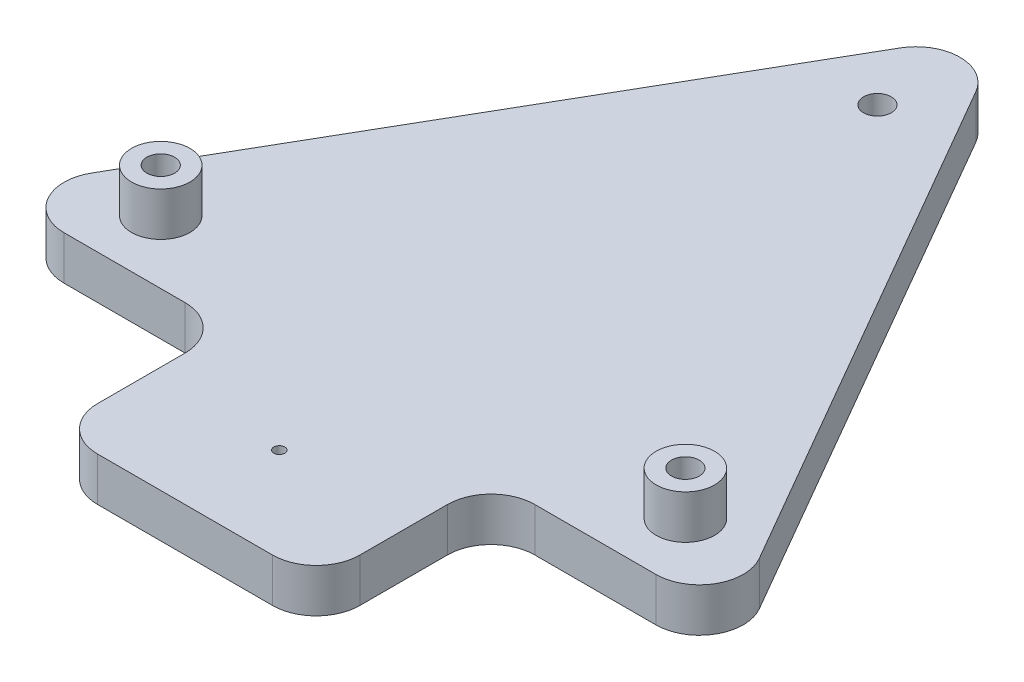
ISO-10303-21;
HEADER;
FILE_DESCRIPTION(('STEP AP214'),'2;1');
FILE_NAME('part.step','',(''),(''),'','','');
FILE_SCHEMA(('AUTOMOTIVE_DESIGN { 1 0 10303 214 1 1 1 1 }'));
ENDSEC;
DATA;
#1=APPLICATION_CONTEXT('core data for automotive mechanical design processes');
#2=APPLICATION_PROTOCOL_DEFINITION('international standard','automotive_design',2000,#1);
#3=PRODUCT_CONTEXT('',#1,'mechanical');
#4=PRODUCT('Part','Part','',(#3));
#5=PRODUCT_RELATED_PRODUCT_CATEGORY('part','',(#4));
#6=PRODUCT_DEFINITION_FORMATION('','',#4);
#7=PRODUCT_DEFINITION_CONTEXT('part definition',#1,'design');
#8=PRODUCT_DEFINITION('design','',#6,#7);
#9=PRODUCT_DEFINITION_SHAPE('','',#8);
#10=(LENGTH_UNIT() NAMED_UNIT(*) SI_UNIT(.MILLI.,.METRE.));
#11=(NAMED_UNIT(*) PLANE_ANGLE_UNIT() SI_UNIT($,.RADIAN.));
#12=(NAMED_UNIT(*) SI_UNIT($,.STERADIAN.) SOLID_ANGLE_UNIT());
#13=UNCERTAINTY_MEASURE_WITH_UNIT(LENGTH_MEASURE(1.E-05),#10,'distance_accuracy_value','');
#14=(GEOMETRIC_REPRESENTATION_CONTEXT(3) GLOBAL_UNCERTAINTY_ASSIGNED_CONTEXT((#13)) GLOBAL_UNIT_ASSIGNED_CONTEXT((#10,
#11,#12)) REPRESENTATION_CONTEXT('',''));
#15=CARTESIAN_POINT('',(0.,0.,0.));
#16=DIRECTION('',(0.,0.,1.));
#17=DIRECTION('',(1.,0.,0.));
#18=AXIS2_PLACEMENT_3D('',#15,#16,#17);
#19=CARTESIAN_POINT('',(-40.,10.,10.));
#20=DIRECTION('',(0.,1.,0.));
#21=DIRECTION('',(0.,0.,1.));
#22=AXIS2_PLACEMENT_3D('',#19,#20,#21);
#23=PLANE('',#22);
#24=CARTESIAN_POINT('',(-60.,10.,-14.4337567297406));
#25=DIRECTION('',(0.,1.,0.));
#26=DIRECTION('',(0.,0.,1.));
#27=AXIS2_PLACEMENT_3D('',#24,#25,#26);
#28=CIRCLE('',#27,6.675);
#29=CARTESIAN_POINT('',(-60.,10.,-7.75875672974062));
#30=VERTEX_POINT('',#29);
#31=EDGE_CURVE('E386',#30,#30,#28,.T.);
#32=ORIENTED_EDGE('',*,*,#31,.F.);
#33=EDGE_LOOP('',(#32));
#34=FACE_BOUND('',#33,.T.);
#35=CARTESIAN_POINT('',(-40.,10.,10.));
#36=DIRECTION('',(0.,-1.,0.));
#37=DIRECTION('',(0.,0.,1.));
#38=AXIS2_PLACEMENT_3D('',#35,#36,#37);
#39=CIRCLE('',#38,10.);
#40=CARTESIAN_POINT('',(-40.0000000000001,10.,0.));
#41=VERTEX_POINT('',#40);
#42=CARTESIAN_POINT('',(-30.,10.,10.0000000000001));
#43=VERTEX_POINT('',#42);
#44=EDGE_CURVE('E218',#41,#43,#39,.T.);
#45=ORIENTED_EDGE('',*,*,#44,.T.);
#46=DIRECTION('',(0.,0.,1.));
#47=VECTOR('',#46,1.);
#48=CARTESIAN_POINT('',(-30.,10.,10.0000000000001));
#49=LINE('',#48,#47);
#50=CARTESIAN_POINT('',(-30.,10.,29.9999999999999));
#51=VERTEX_POINT('',#50);
#52=EDGE_CURVE('E118',#43,#51,#49,.T.);
#53=ORIENTED_EDGE('',*,*,#52,.T.);
#54=CARTESIAN_POINT('',(-20.,10.,30.));
#55=DIRECTION('',(0.,1.,0.));
#56=DIRECTION('',(0.,0.,1.));
#57=AXIS2_PLACEMENT_3D('',#54,#55,#56);
#58=CIRCLE('',#57,10.);
#59=CARTESIAN_POINT('',(-20.,10.,40.));
#60=VERTEX_POINT('',#59);
#61=EDGE_CURVE('E263',#51,#60,#58,.T.);
#62=ORIENTED_EDGE('',*,*,#61,.T.);
#63=DIRECTION('',(1.,0.,0.));
#64=VECTOR('',#63,1.);
#65=CARTESIAN_POINT('',(-19.9999999999999,10.,40.));
#66=LINE('',#65,#64);
#67=CARTESIAN_POINT('',(19.9999999999999,10.,40.));
#68=VERTEX_POINT('',#67);
#69=EDGE_CURVE('E283',#60,#68,#66,.T.);
#70=ORIENTED_EDGE('',*,*,#69,.T.);
#71=CARTESIAN_POINT('',(20.,10.,30.));
#72=DIRECTION('',(0.,1.,0.));
#73=DIRECTION('',(0.,0.,1.));
#74=AXIS2_PLACEMENT_3D('',#71,#72,#73);
#75=CIRCLE('',#74,10.);
#76=CARTESIAN_POINT('',(30.,10.,29.9999999999999));
#77=VERTEX_POINT('',#76);
#78=EDGE_CURVE('E279',#68,#77,#75,.T.);
#79=ORIENTED_EDGE('',*,*,#78,.T.);
#80=DIRECTION('',(0.,0.,-1.));
#81=VECTOR('',#80,1.);
#82=CARTESIAN_POINT('',(30.,10.,29.9999999999999));
#83=LINE('',#82,#81);
#84=CARTESIAN_POINT('',(30.,10.,10.0000000000001));
#85=VERTEX_POINT('',#84);
#86=EDGE_CURVE('E282',#77,#85,#83,.T.);
#87=ORIENTED_EDGE('',*,*,#86,.T.);
#88=CARTESIAN_POINT('',(40.,10.,9.99999999999999));
#89=DIRECTION('',(0.,-1.,0.));
#90=DIRECTION('',(0.,0.,-1.));
#91=AXIS2_PLACEMENT_3D('',#88,#89,#90);
#92=CIRCLE('',#91,10.);
#93=CARTESIAN_POINT('',(40.,10.,0.));
#94=VERTEX_POINT('',#93);
#95=EDGE_CURVE('E287',#85,#94,#92,.T.);
#96=ORIENTED_EDGE('',*,*,#95,.T.);
#97=DIRECTION('',(1.,0.,0.));
#98=VECTOR('',#97,1.);
#99=CARTESIAN_POINT('',(40.0000000000001,10.,0.));
#100=LINE('',#99,#98);
#101=CARTESIAN_POINT('',(67.6794919243111,10.,0.));
#102=VERTEX_POINT('',#101);
#103=EDGE_CURVE('E294',#94,#102,#100,.T.);
#104=ORIENTED_EDGE('',*,*,#103,.T.);
#105=CARTESIAN_POINT('',(67.6794919243113,10.,-10.));
#106=DIRECTION('',(0.,1.,0.));
#107=DIRECTION('',(0.,0.,1.));
#108=AXIS2_PLACEMENT_3D('',#105,#106,#107);
#109=CIRCLE('',#108,9.99999999999999);
#110=CARTESIAN_POINT('',(76.3397459621555,10.,-15.0000000000001));
#111=VERTEX_POINT('',#110);
#112=EDGE_CURVE('E297',#102,#111,#109,.T.);
#113=ORIENTED_EDGE('',*,*,#112,.T.);
#114=DIRECTION('',(-0.5,0.,-0.866025403784439));
#115=VECTOR('',#114,1.);
#116=CARTESIAN_POINT('',(8.66025403784444,10.,-132.224318643354));
#117=LINE('',#116,#115);
#118=CARTESIAN_POINT('',(8.66025403784444,10.,-132.224318643354));
#119=VERTEX_POINT('',#118);
#120=EDGE_CURVE('E300',#111,#119,#117,.T.);
#121=ORIENTED_EDGE('',*,*,#120,.T.);
#122=CARTESIAN_POINT('',(0.,10.,-127.224318643355));
#123=DIRECTION('',(0.,1.,0.));
#124=DIRECTION('',(0.,0.,-1.));
#125=AXIS2_PLACEMENT_3D('',#122,#123,#124);
#126=CIRCLE('',#125,10.);
#127=CARTESIAN_POINT('',(-8.66025403784448,10.,-132.224318643354));
#128=VERTEX_POINT('',#127);
#129=EDGE_CURVE('E155',#119,#128,#126,.T.);
#130=ORIENTED_EDGE('',*,*,#129,.T.);
#131=DIRECTION('',(-0.5,0.,0.866025403784439));
#132=VECTOR('',#131,1.);
#133=CARTESIAN_POINT('',(-76.3397459621555,10.,-15.0000000000001));
#134=LINE('',#133,#132);
#135=CARTESIAN_POINT('',(-76.3397459621555,10.,-15.0000000000001));
#136=VERTEX_POINT('',#135);
#137=EDGE_CURVE('E149',#128,#136,#134,.T.);
#138=ORIENTED_EDGE('',*,*,#137,.T.);
#139=CARTESIAN_POINT('',(-67.6794919243112,10.,-10.));
#140=DIRECTION('',(0.,1.,0.));
#141=DIRECTION('',(0.,0.,-1.));
#142=AXIS2_PLACEMENT_3D('',#139,#140,#141);
#143=CIRCLE('',#142,10.);
#144=CARTESIAN_POINT('',(-67.6794919243111,10.,0.));
#145=VERTEX_POINT('',#144);
#146=EDGE_CURVE('E153',#136,#145,#143,.T.);
#147=ORIENTED_EDGE('',*,*,#146,.T.);
#148=DIRECTION('',(1.,0.,0.));
#149=VECTOR('',#148,1.);
#150=CARTESIAN_POINT('',(-67.6794919243111,10.,0.));
#151=LINE('',#150,#149);
#152=EDGE_CURVE('E57',#145,#41,#151,.T.);
#153=ORIENTED_EDGE('',*,*,#152,.T.);
#154=EDGE_LOOP('',(#45,#53,#62,#70,#79,#87,#96,#104,#113,#121,#130,#138,#147,#153));
#155=FACE_BOUND('',#154,.T.);
#156=CARTESIAN_POINT('',(0.,10.,-118.356805183873));
#157=DIRECTION('',(0.,1.,0.));
#158=DIRECTION('',(0.,0.,1.));
#159=AXIS2_PLACEMENT_3D('',#156,#157,#158);
#160=CIRCLE('',#159,3.175);
#161=CARTESIAN_POINT('',(0.,10.,-115.181805183873));
#162=VERTEX_POINT('',#161);
#163=EDGE_CURVE('E407',#162,#162,#160,.T.);
#164=ORIENTED_EDGE('',*,*,#163,.F.);
#165=EDGE_LOOP('',(#164));
#166=FACE_BOUND('',#165,.T.);
#167=CARTESIAN_POINT('',(0.,10.,18.4501948161268));
#168=DIRECTION('',(0.,1.,0.));
#169=DIRECTION('',(0.,0.,1.));
#170=AXIS2_PLACEMENT_3D('',#167,#168,#169);
#171=CIRCLE('',#170,1.25);
#172=CARTESIAN_POINT('',(0.,10.,19.7001948161268));
#173=VERTEX_POINT('',#172);
#174=EDGE_CURVE('E395',#173,#173,#171,.T.);
#175=ORIENTED_EDGE('',*,*,#174,.F.);
#176=EDGE_LOOP('',(#175));
#177=FACE_BOUND('',#176,.T.);
#178=CARTESIAN_POINT('',(60.,10.,-14.4337567297406));
#179=DIRECTION('',(0.,1.,0.));
#180=DIRECTION('',(0.,0.,1.));
#181=AXIS2_PLACEMENT_3D('',#178,#179,#180);
#182=CIRCLE('',#181,6.675);
#183=CARTESIAN_POINT('',(60.,10.,-7.75875672974062));
#184=VERTEX_POINT('',#183);
#185=EDGE_CURVE('E374',#184,#184,#182,.T.);
#186=ORIENTED_EDGE('',*,*,#185,.F.);
#187=EDGE_LOOP('',(#186));
#188=FACE_BOUND('',#187,.T.);
#189=ADVANCED_FACE('F39',(#34,#155,#166,#177,#188),#23,.T.);
#190=CARTESIAN_POINT('',(-40.,0.,10.));
#191=DIRECTION('',(0.,1.,0.));
#192=DIRECTION('',(0.,0.,1.));
#193=AXIS2_PLACEMENT_3D('',#190,#191,#192);
#194=PLANE('',#193);
#195=CARTESIAN_POINT('',(-40.,0.,10.));
#196=DIRECTION('',(0.,-1.,0.));
#197=DIRECTION('',(0.,0.,1.));
#198=AXIS2_PLACEMENT_3D('',#195,#196,#197);
#199=CIRCLE('',#198,10.);
#200=CARTESIAN_POINT('',(-40.0000000000001,0.,0.));
#201=VERTEX_POINT('',#200);
#202=CARTESIAN_POINT('',(-30.,0.,10.0000000000001));
#203=VERTEX_POINT('',#202);
#204=EDGE_CURVE('E177',#201,#203,#199,.T.);
#205=ORIENTED_EDGE('',*,*,#204,.F.);
#206=DIRECTION('',(1.,0.,0.));
#207=VECTOR('',#206,1.);
#208=CARTESIAN_POINT('',(-67.6794919243111,0.,0.));
#209=LINE('',#208,#207);
#210=CARTESIAN_POINT('',(-67.6794919243111,0.,0.));
#211=VERTEX_POINT('',#210);
#212=EDGE_CURVE('E110',#211,#201,#209,.T.);
#213=ORIENTED_EDGE('',*,*,#212,.F.);
#214=CARTESIAN_POINT('',(-67.6794919243112,0.,-10.));
#215=DIRECTION('',(0.,1.,0.));
#216=DIRECTION('',(0.,0.,-1.));
#217=AXIS2_PLACEMENT_3D('',#214,#215,#216);
#218=CIRCLE('',#217,10.);
#219=CARTESIAN_POINT('',(-76.3397459621555,0.,-15.0000000000001));
#220=VERTEX_POINT('',#219);
#221=EDGE_CURVE('E104',#220,#211,#218,.T.);
#222=ORIENTED_EDGE('',*,*,#221,.F.);
#223=DIRECTION('',(-0.5,0.,0.866025403784439));
#224=VECTOR('',#223,1.);
#225=CARTESIAN_POINT('',(-76.3397459621555,0.,-15.0000000000001));
#226=LINE('',#225,#224);
#227=CARTESIAN_POINT('',(-8.66025403784448,0.,-132.224318643354));
#228=VERTEX_POINT('',#227);
#229=EDGE_CURVE('E164',#228,#220,#226,.T.);
#230=ORIENTED_EDGE('',*,*,#229,.F.);
#231=CARTESIAN_POINT('',(0.,0.,-127.224318643355));
#232=DIRECTION('',(0.,1.,0.));
#233=DIRECTION('',(0.,0.,-1.));
#234=AXIS2_PLACEMENT_3D('',#231,#232,#233);
#235=CIRCLE('',#234,10.);
#236=CARTESIAN_POINT('',(8.66025403784444,0.,-132.224318643354));
#237=VERTEX_POINT('',#236);
#238=EDGE_CURVE('E209',#237,#228,#235,.T.);
#239=ORIENTED_EDGE('',*,*,#238,.F.);
#240=DIRECTION('',(-0.5,0.,-0.866025403784439));
#241=VECTOR('',#240,1.);
#242=CARTESIAN_POINT('',(8.66025403784444,0.,-132.224318643354));
#243=LINE('',#242,#241);
#244=CARTESIAN_POINT('',(76.3397459621555,0.,-15.0000000000001));
#245=VERTEX_POINT('',#244);
#246=EDGE_CURVE('E206',#245,#237,#243,.T.);
#247=ORIENTED_EDGE('',*,*,#246,.F.);
#248=CARTESIAN_POINT('',(67.6794919243113,0.,-10.));
#249=DIRECTION('',(0.,1.,0.));
#250=DIRECTION('',(0.,0.,1.));
#251=AXIS2_PLACEMENT_3D('',#248,#249,#250);
#252=CIRCLE('',#251,9.99999999999999);
#253=CARTESIAN_POINT('',(67.6794919243111,0.,0.));
#254=VERTEX_POINT('',#253);
#255=EDGE_CURVE('E203',#254,#245,#252,.T.);
#256=ORIENTED_EDGE('',*,*,#255,.F.);
#257=DIRECTION('',(1.,0.,0.));
#258=VECTOR('',#257,1.);
#259=CARTESIAN_POINT('',(40.0000000000001,0.,0.));
#260=LINE('',#259,#258);
#261=CARTESIAN_POINT('',(40.,0.,0.));
#262=VERTEX_POINT('',#261);
#263=EDGE_CURVE('E200',#262,#254,#260,.T.);
#264=ORIENTED_EDGE('',*,*,#263,.F.);
#265=CARTESIAN_POINT('',(40.,0.,9.99999999999999));
#266=DIRECTION('',(0.,-1.,0.));
#267=DIRECTION('',(0.,0.,-1.));
#268=AXIS2_PLACEMENT_3D('',#265,#266,#267);
#269=CIRCLE('',#268,10.);
#270=CARTESIAN_POINT('',(30.,0.,10.0000000000001));
#271=VERTEX_POINT('',#270);
#272=EDGE_CURVE('E197',#271,#262,#269,.T.);
#273=ORIENTED_EDGE('',*,*,#272,.F.);
#274=DIRECTION('',(0.,0.,-1.));
#275=VECTOR('',#274,1.);
#276=CARTESIAN_POINT('',(30.,0.,29.9999999999999));
#277=LINE('',#276,#275);
#278=CARTESIAN_POINT('',(30.,0.,29.9999999999999));
#279=VERTEX_POINT('',#278);
#280=EDGE_CURVE('E194',#279,#271,#277,.T.);
#281=ORIENTED_EDGE('',*,*,#280,.F.);
#282=CARTESIAN_POINT('',(20.,0.,30.));
#283=DIRECTION('',(0.,1.,0.));
#284=DIRECTION('',(0.,0.,1.));
#285=AXIS2_PLACEMENT_3D('',#282,#283,#284);
#286=CIRCLE('',#285,10.);
#287=CARTESIAN_POINT('',(19.9999999999999,0.,40.));
#288=VERTEX_POINT('',#287);
#289=EDGE_CURVE('E191',#288,#279,#286,.T.);
#290=ORIENTED_EDGE('',*,*,#289,.F.);
#291=DIRECTION('',(1.,0.,0.));
#292=VECTOR('',#291,1.);
#293=CARTESIAN_POINT('',(-19.9999999999999,0.,40.));
#294=LINE('',#293,#292);
#295=CARTESIAN_POINT('',(-20.,0.,40.));
#296=VERTEX_POINT('',#295);
#297=EDGE_CURVE('E188',#296,#288,#294,.T.);
#298=ORIENTED_EDGE('',*,*,#297,.F.);
#299=CARTESIAN_POINT('',(-20.,0.,30.));
#300=DIRECTION('',(0.,1.,0.));
#301=DIRECTION('',(0.,0.,1.));
#302=AXIS2_PLACEMENT_3D('',#299,#300,#301);
#303=CIRCLE('',#302,10.);
#304=CARTESIAN_POINT('',(-30.,0.,29.9999999999999));
#305=VERTEX_POINT('',#304);
#306=EDGE_CURVE('E185',#305,#296,#303,.T.);
#307=ORIENTED_EDGE('',*,*,#306,.F.);
#308=DIRECTION('',(0.,0.,1.));
#309=VECTOR('',#308,1.);
#310=CARTESIAN_POINT('',(-30.,0.,10.0000000000001));
#311=LINE('',#310,#309);
#312=EDGE_CURVE('E181',#203,#305,#311,.T.);
#313=ORIENTED_EDGE('',*,*,#312,.F.);
#314=EDGE_LOOP('',(#205,#213,#222,#230,#239,#247,#256,#264,#273,#281,#290,#298,#307,#313));
#315=FACE_BOUND('',#314,.T.);
#316=CARTESIAN_POINT('',(-60.,0.,-14.4337567297406));
#317=DIRECTION('',(0.,1.,0.));
#318=DIRECTION('',(0.,0.,1.));
#319=AXIS2_PLACEMENT_3D('',#316,#317,#318);
#320=CIRCLE('',#319,3.175);
#321=CARTESIAN_POINT('',(-60.,0.,-11.2587567297406));
#322=VERTEX_POINT('',#321);
#323=EDGE_CURVE('E182',#322,#322,#320,.T.);
#324=ORIENTED_EDGE('',*,*,#323,.T.);
#325=EDGE_LOOP('',(#324));
#326=FACE_BOUND('',#325,.T.);
#327=CARTESIAN_POINT('',(0.,0.,-118.356805183873));
#328=DIRECTION('',(0.,1.,0.));
#329=DIRECTION('',(0.,0.,1.));
#330=AXIS2_PLACEMENT_3D('',#327,#328,#329);
#331=CIRCLE('',#330,3.175);
#332=CARTESIAN_POINT('',(0.,0.,-115.181805183873));
#333=VERTEX_POINT('',#332);
#334=EDGE_CURVE('E406',#333,#333,#331,.T.);
#335=ORIENTED_EDGE('',*,*,#334,.T.);
#336=EDGE_LOOP('',(#335));
#337=FACE_BOUND('',#336,.T.);
#338=CARTESIAN_POINT('',(60.,0.,-14.4337567297406));
#339=DIRECTION('',(0.,1.,0.));
#340=DIRECTION('',(0.,0.,1.));
#341=AXIS2_PLACEMENT_3D('',#338,#339,#340);
#342=CIRCLE('',#341,3.175);
#343=CARTESIAN_POINT('',(60.,0.,-11.2587567297406));
#344=VERTEX_POINT('',#343);
#345=EDGE_CURVE('E399',#344,#344,#342,.T.);
#346=ORIENTED_EDGE('',*,*,#345,.T.);
#347=EDGE_LOOP('',(#346));
#348=FACE_BOUND('',#347,.T.);
#349=CARTESIAN_POINT('',(0.,0.,18.4501948161268));
#350=DIRECTION('',(0.,1.,0.));
#351=DIRECTION('',(0.,0.,1.));
#352=AXIS2_PLACEMENT_3D('',#349,#350,#351);
#353=CIRCLE('',#352,1.25);
#354=CARTESIAN_POINT('',(0.,0.,19.7001948161268));
#355=VERTEX_POINT('',#354);
#356=EDGE_CURVE('E391',#355,#355,#353,.T.);
#357=ORIENTED_EDGE('',*,*,#356,.T.);
#358=EDGE_LOOP('',(#357));
#359=FACE_BOUND('',#358,.T.);
#360=ADVANCED_FACE('F267',(#315,#326,#337,#348,#359),#194,.F.);
#361=CARTESIAN_POINT('',(-40.,10.,10.));
#362=DIRECTION('',(0.,-1.,0.));
#363=DIRECTION('',(0.,0.,-1.));
#364=AXIS2_PLACEMENT_3D('',#361,#362,#363);
#365=CYLINDRICAL_SURFACE('',#364,10.);
#366=ORIENTED_EDGE('',*,*,#204,.T.);
#367=DIRECTION('',(0.,-1.,0.));
#368=VECTOR('',#367,1.);
#369=CARTESIAN_POINT('',(-30.,10.,10.0000000000001));
#370=LINE('',#369,#368);
#371=EDGE_CURVE('E11',#43,#203,#370,.T.);
#372=ORIENTED_EDGE('',*,*,#371,.F.);
#373=ORIENTED_EDGE('',*,*,#44,.F.);
#374=DIRECTION('',(0.,-1.,0.));
#375=VECTOR('',#374,1.);
#376=CARTESIAN_POINT('',(-40.0000000000001,10.,0.));
#377=LINE('',#376,#375);
#378=EDGE_CURVE('E173',#41,#201,#377,.T.);
#379=ORIENTED_EDGE('',*,*,#378,.T.);
#380=EDGE_LOOP('',(#366,#372,#373,#379));
#381=FACE_BOUND('',#380,.T.);
#382=ADVANCED_FACE('F41',(#381),#365,.F.);
#383=CARTESIAN_POINT('',(-30.,10.,10.0000000000001));
#384=DIRECTION('',(1.,0.,0.));
#385=DIRECTION('',(0.,0.,-1.));
#386=AXIS2_PLACEMENT_3D('',#383,#384,#385);
#387=PLANE('',#386);
#388=ORIENTED_EDGE('',*,*,#312,.T.);
#389=DIRECTION('',(0.,-1.,0.));
#390=VECTOR('',#389,1.);
#391=CARTESIAN_POINT('',(-30.,10.,29.9999999999999));
#392=LINE('',#391,#390);
#393=EDGE_CURVE('E49',#51,#305,#392,.T.);
#394=ORIENTED_EDGE('',*,*,#393,.F.);
#395=ORIENTED_EDGE('',*,*,#52,.F.);
#396=ORIENTED_EDGE('',*,*,#371,.T.);
#397=EDGE_LOOP('',(#388,#394,#395,#396));
#398=FACE_BOUND('',#397,.T.);
#399=ADVANCED_FACE('F589',(#398),#387,.F.);
#400=CARTESIAN_POINT('',(-20.,10.,30.));
#401=DIRECTION('',(0.,-1.,0.));
#402=DIRECTION('',(0.,0.,-1.));
#403=AXIS2_PLACEMENT_3D('',#400,#401,#402);
#404=CYLINDRICAL_SURFACE('',#403,10.);
#405=ORIENTED_EDGE('',*,*,#306,.T.);
#406=DIRECTION('',(0.,-1.,0.));
#407=VECTOR('',#406,1.);
#408=CARTESIAN_POINT('',(-20.,10.,40.));
#409=LINE('',#408,#407);
#410=EDGE_CURVE('E253',#60,#296,#409,.T.);
#411=ORIENTED_EDGE('',*,*,#410,.F.);
#412=ORIENTED_EDGE('',*,*,#61,.F.);
#413=ORIENTED_EDGE('',*,*,#393,.T.);
#414=EDGE_LOOP('',(#405,#411,#412,#413));
#415=FACE_BOUND('',#414,.T.);
#416=ADVANCED_FACE('F261',(#415),#404,.T.);
#417=CARTESIAN_POINT('',(-19.9999999999999,10.,40.));
#418=DIRECTION('',(0.,0.,-1.));
#419=DIRECTION('',(-1.,0.,0.));
#420=AXIS2_PLACEMENT_3D('',#417,#418,#419);
#421=PLANE('',#420);
#422=ORIENTED_EDGE('',*,*,#297,.T.);
#423=DIRECTION('',(0.,-1.,0.));
#424=VECTOR('',#423,1.);
#425=CARTESIAN_POINT('',(19.9999999999999,10.,40.));
#426=LINE('',#425,#424);
#427=EDGE_CURVE('E249',#68,#288,#426,.T.);
#428=ORIENTED_EDGE('',*,*,#427,.F.);
#429=ORIENTED_EDGE('',*,*,#69,.F.);
#430=ORIENTED_EDGE('',*,*,#410,.T.);
#431=EDGE_LOOP('',(#422,#428,#429,#430));
#432=FACE_BOUND('',#431,.T.);
#433=ADVANCED_FACE('F273',(#432),#421,.F.);
#434=CARTESIAN_POINT('',(20.,10.,30.));
#435=DIRECTION('',(0.,-1.,0.));
#436=DIRECTION('',(0.,0.,-1.));
#437=AXIS2_PLACEMENT_3D('',#434,#435,#436);
#438=CYLINDRICAL_SURFACE('',#437,10.);
#439=ORIENTED_EDGE('',*,*,#289,.T.);
#440=DIRECTION('',(0.,-1.,0.));
#441=VECTOR('',#440,1.);
#442=CARTESIAN_POINT('',(30.,10.,29.9999999999999));
#443=LINE('',#442,#441);
#444=EDGE_CURVE('E245',#77,#279,#443,.T.);
#445=ORIENTED_EDGE('',*,*,#444,.F.);
#446=ORIENTED_EDGE('',*,*,#78,.F.);
#447=ORIENTED_EDGE('',*,*,#427,.T.);
#448=EDGE_LOOP('',(#439,#445,#446,#447));
#449=FACE_BOUND('',#448,.T.);
#450=ADVANCED_FACE('F277',(#449),#438,.T.);
#451=CARTESIAN_POINT('',(30.,10.,29.9999999999999));
#452=DIRECTION('',(-1.,0.,0.));
#453=DIRECTION('',(0.,0.,1.));
#454=AXIS2_PLACEMENT_3D('',#451,#452,#453);
#455=PLANE('',#454);
#456=ORIENTED_EDGE('',*,*,#280,.T.);
#457=DIRECTION('',(0.,-1.,0.));
#458=VECTOR('',#457,1.);
#459=CARTESIAN_POINT('',(30.,10.,10.0000000000001));
#460=LINE('',#459,#458);
#461=EDGE_CURVE('E241',#85,#271,#460,.T.);
#462=ORIENTED_EDGE('',*,*,#461,.F.);
#463=ORIENTED_EDGE('',*,*,#86,.F.);
#464=ORIENTED_EDGE('',*,*,#444,.T.);
#465=EDGE_LOOP('',(#456,#462,#463,#464));
#466=FACE_BOUND('',#465,.T.);
#467=ADVANCED_FACE('F554',(#466),#455,.F.);
#468=CARTESIAN_POINT('',(40.,10.,9.99999999999999));
#469=DIRECTION('',(0.,-1.,0.));
#470=DIRECTION('',(0.,0.,-1.));
#471=AXIS2_PLACEMENT_3D('',#468,#469,#470);
#472=CYLINDRICAL_SURFACE('',#471,10.);
#473=ORIENTED_EDGE('',*,*,#272,.T.);
#474=DIRECTION('',(0.,-1.,0.));
#475=VECTOR('',#474,1.);
#476=CARTESIAN_POINT('',(40.,10.,0.));
#477=LINE('',#476,#475);
#478=EDGE_CURVE('E237',#94,#262,#477,.T.);
#479=ORIENTED_EDGE('',*,*,#478,.F.);
#480=ORIENTED_EDGE('',*,*,#95,.F.);
#481=ORIENTED_EDGE('',*,*,#461,.T.);
#482=EDGE_LOOP('',(#473,#479,#480,#481));
#483=FACE_BOUND('',#482,.T.);
#484=ADVANCED_FACE('F544',(#483),#472,.F.);
#485=CARTESIAN_POINT('',(40.0000000000001,10.,0.));
#486=DIRECTION('',(0.,0.,-1.));
#487=DIRECTION('',(-1.,0.,0.));
#488=AXIS2_PLACEMENT_3D('',#485,#486,#487);
#489=PLANE('',#488);
#490=ORIENTED_EDGE('',*,*,#263,.T.);
#491=DIRECTION('',(0.,-1.,0.));
#492=VECTOR('',#491,1.);
#493=CARTESIAN_POINT('',(67.6794919243111,10.,0.));
#494=LINE('',#493,#492);
#495=EDGE_CURVE('E233',#102,#254,#494,.T.);
#496=ORIENTED_EDGE('',*,*,#495,.F.);
#497=ORIENTED_EDGE('',*,*,#103,.F.);
#498=ORIENTED_EDGE('',*,*,#478,.T.);
#499=EDGE_LOOP('',(#490,#496,#497,#498));
#500=FACE_BOUND('',#499,.T.);
#501=ADVANCED_FACE('F534',(#500),#489,.F.);
#502=CARTESIAN_POINT('',(67.6794919243113,10.,-10.));
#503=DIRECTION('',(0.,-1.,0.));
#504=DIRECTION('',(0.,0.,-1.));
#505=AXIS2_PLACEMENT_3D('',#502,#503,#504);
#506=CYLINDRICAL_SURFACE('',#505,9.99999999999999);
#507=ORIENTED_EDGE('',*,*,#255,.T.);
#508=DIRECTION('',(0.,-1.,0.));
#509=VECTOR('',#508,1.);
#510=CARTESIAN_POINT('',(76.3397459621555,10.,-15.0000000000001));
#511=LINE('',#510,#509);
#512=EDGE_CURVE('E229',#111,#245,#511,.T.);
#513=ORIENTED_EDGE('',*,*,#512,.F.);
#514=ORIENTED_EDGE('',*,*,#112,.F.);
#515=ORIENTED_EDGE('',*,*,#495,.T.);
#516=EDGE_LOOP('',(#507,#513,#514,#515));
#517=FACE_BOUND('',#516,.T.);
#518=ADVANCED_FACE('F525',(#517),#506,.T.);
#519=CARTESIAN_POINT('',(8.66025403784444,10.,-132.224318643354));
#520=DIRECTION('',(-0.866025403784439,0.,0.5));
#521=DIRECTION('',(0.5,0.,0.866025403784439));
#522=AXIS2_PLACEMENT_3D('',#519,#520,#521);
#523=PLANE('',#522);
#524=ORIENTED_EDGE('',*,*,#246,.T.);
#525=DIRECTION('',(0.,-1.,0.));
#526=VECTOR('',#525,1.);
#527=CARTESIAN_POINT('',(8.66025403784444,10.,-132.224318643354));
#528=LINE('',#527,#526);
#529=EDGE_CURVE('E225',#119,#237,#528,.T.);
#530=ORIENTED_EDGE('',*,*,#529,.F.);
#531=ORIENTED_EDGE('',*,*,#120,.F.);
#532=ORIENTED_EDGE('',*,*,#512,.T.);
#533=EDGE_LOOP('',(#524,#530,#531,#532));
#534=FACE_BOUND('',#533,.T.);
#535=ADVANCED_FACE('F308',(#534),#523,.F.);
#536=CARTESIAN_POINT('',(0.,10.,-127.224318643355));
#537=DIRECTION('',(0.,-1.,0.));
#538=DIRECTION('',(0.,0.,-1.));
#539=AXIS2_PLACEMENT_3D('',#536,#537,#538);
#540=CYLINDRICAL_SURFACE('',#539,10.);
#541=ORIENTED_EDGE('',*,*,#238,.T.);
#542=DIRECTION('',(0.,-1.,0.));
#543=VECTOR('',#542,1.);
#544=CARTESIAN_POINT('',(-8.66025403784448,10.,-132.224318643354));
#545=LINE('',#544,#543);
#546=EDGE_CURVE('E166',#128,#228,#545,.T.);
#547=ORIENTED_EDGE('',*,*,#546,.F.);
#548=ORIENTED_EDGE('',*,*,#129,.F.);
#549=ORIENTED_EDGE('',*,*,#529,.T.);
#550=EDGE_LOOP('',(#541,#547,#548,#549));
#551=FACE_BOUND('',#550,.T.);
#552=ADVANCED_FACE('F312',(#551),#540,.T.);
#553=CARTESIAN_POINT('',(-76.3397459621555,10.,-15.0000000000001));
#554=DIRECTION('',(0.866025403784439,0.,0.5));
#555=DIRECTION('',(0.5,0.,-0.866025403784439));
#556=AXIS2_PLACEMENT_3D('',#553,#554,#555);
#557=PLANE('',#556);
#558=ORIENTED_EDGE('',*,*,#229,.T.);
#559=DIRECTION('',(0.,-1.,0.));
#560=VECTOR('',#559,1.);
#561=CARTESIAN_POINT('',(-76.3397459621555,10.,-15.0000000000001));
#562=LINE('',#561,#560);
#563=EDGE_CURVE('E161',#136,#220,#562,.T.);
#564=ORIENTED_EDGE('',*,*,#563,.F.);
#565=ORIENTED_EDGE('',*,*,#137,.F.);
#566=ORIENTED_EDGE('',*,*,#546,.T.);
#567=EDGE_LOOP('',(#558,#564,#565,#566));
#568=FACE_BOUND('',#567,.T.);
#569=ADVANCED_FACE('F162',(#568),#557,.F.);
#570=CARTESIAN_POINT('',(-67.6794919243112,10.,-10.));
#571=DIRECTION('',(0.,-1.,0.));
#572=DIRECTION('',(0.,0.,-1.));
#573=AXIS2_PLACEMENT_3D('',#570,#571,#572);
#574=CYLINDRICAL_SURFACE('',#573,10.);
#575=ORIENTED_EDGE('',*,*,#221,.T.);
#576=DIRECTION('',(0.,-1.,0.));
#577=VECTOR('',#576,1.);
#578=CARTESIAN_POINT('',(-67.6794919243111,10.,0.));
#579=LINE('',#578,#577);
#580=EDGE_CURVE('E167',#145,#211,#579,.T.);
#581=ORIENTED_EDGE('',*,*,#580,.F.);
#582=ORIENTED_EDGE('',*,*,#146,.F.);
#583=ORIENTED_EDGE('',*,*,#563,.T.);
#584=EDGE_LOOP('',(#575,#581,#582,#583));
#585=FACE_BOUND('',#584,.T.);
#586=ADVANCED_FACE('F169',(#585),#574,.T.);
#587=CARTESIAN_POINT('',(-67.6794919243111,10.,0.));
#588=DIRECTION('',(0.,0.,-1.));
#589=DIRECTION('',(-1.,0.,0.));
#590=AXIS2_PLACEMENT_3D('',#587,#588,#589);
#591=PLANE('',#590);
#592=ORIENTED_EDGE('',*,*,#212,.T.);
#593=ORIENTED_EDGE('',*,*,#378,.F.);
#594=ORIENTED_EDGE('',*,*,#152,.F.);
#595=ORIENTED_EDGE('',*,*,#580,.T.);
#596=EDGE_LOOP('',(#592,#593,#594,#595));
#597=FACE_BOUND('',#596,.T.);
#598=ADVANCED_FACE('F316',(#597),#591,.F.);
#599=CARTESIAN_POINT('',(-60.,10.,-14.4337567297406));
#600=DIRECTION('',(0.,-1.,0.));
#601=DIRECTION('',(0.,0.,-1.));
#602=AXIS2_PLACEMENT_3D('',#599,#600,#601);
#603=CYLINDRICAL_SURFACE('',#602,3.175);
#604=ORIENTED_EDGE('',*,*,#323,.F.);
#605=EDGE_LOOP('',(#604));
#606=FACE_BOUND('',#605,.T.);
#607=CARTESIAN_POINT('',(-60.,20.,-14.4337567297406));
#608=DIRECTION('',(0.,1.,0.));
#609=DIRECTION('',(0.,0.,1.));
#610=AXIS2_PLACEMENT_3D('',#607,#608,#609);
#611=CIRCLE('',#610,3.175);
#612=CARTESIAN_POINT('',(-60.,20.,-11.2587567297406));
#613=VERTEX_POINT('',#612);
#614=EDGE_CURVE('E381',#613,#613,#611,.T.);
#615=ORIENTED_EDGE('',*,*,#614,.T.);
#616=EDGE_LOOP('',(#615));
#617=FACE_BOUND('',#616,.T.);
#618=ADVANCED_FACE('F318',(#606,#617),#603,.F.);
#619=CARTESIAN_POINT('',(0.,10.,-118.356805183873));
#620=DIRECTION('',(0.,-1.,0.));
#621=DIRECTION('',(0.,0.,-1.));
#622=AXIS2_PLACEMENT_3D('',#619,#620,#621);
#623=CYLINDRICAL_SURFACE('',#622,3.175);
#624=ORIENTED_EDGE('',*,*,#163,.T.);
#625=EDGE_LOOP('',(#624));
#626=FACE_BOUND('',#625,.T.);
#627=ORIENTED_EDGE('',*,*,#334,.F.);
#628=EDGE_LOOP('',(#627));
#629=FACE_BOUND('',#628,.T.);
#630=ADVANCED_FACE('F324',(#626,#629),#623,.F.);
#631=CARTESIAN_POINT('',(60.,10.,-14.4337567297406));
#632=DIRECTION('',(0.,-1.,0.));
#633=DIRECTION('',(0.,0.,-1.));
#634=AXIS2_PLACEMENT_3D('',#631,#632,#633);
#635=CYLINDRICAL_SURFACE('',#634,3.175);
#636=ORIENTED_EDGE('',*,*,#345,.F.);
#637=EDGE_LOOP('',(#636));
#638=FACE_BOUND('',#637,.T.);
#639=CARTESIAN_POINT('',(60.,20.,-14.4337567297406));
#640=DIRECTION('',(0.,1.,0.));
#641=DIRECTION('',(0.,0.,1.));
#642=AXIS2_PLACEMENT_3D('',#639,#640,#641);
#643=CIRCLE('',#642,3.175);
#644=CARTESIAN_POINT('',(60.,20.,-11.2587567297406));
#645=VERTEX_POINT('',#644);
#646=EDGE_CURVE('E371',#645,#645,#643,.T.);
#647=ORIENTED_EDGE('',*,*,#646,.T.);
#648=EDGE_LOOP('',(#647));
#649=FACE_BOUND('',#648,.T.);
#650=ADVANCED_FACE('F339',(#638,#649),#635,.F.);
#651=CARTESIAN_POINT('',(0.,10.,18.4501948161268));
#652=DIRECTION('',(0.,-1.,0.));
#653=DIRECTION('',(0.,0.,-1.));
#654=AXIS2_PLACEMENT_3D('',#651,#652,#653);
#655=CYLINDRICAL_SURFACE('',#654,1.25);
#656=ORIENTED_EDGE('',*,*,#174,.T.);
#657=EDGE_LOOP('',(#656));
#658=FACE_BOUND('',#657,.T.);
#659=ORIENTED_EDGE('',*,*,#356,.F.);
#660=EDGE_LOOP('',(#659));
#661=FACE_BOUND('',#660,.T.);
#662=ADVANCED_FACE('F343',(#658,#661),#655,.F.);
#663=CARTESIAN_POINT('',(-60.,20.,-14.4337567297406));
#664=DIRECTION('',(0.,1.,0.));
#665=DIRECTION('',(0.,0.,1.));
#666=AXIS2_PLACEMENT_3D('',#663,#664,#665);
#667=PLANE('',#666);
#668=CARTESIAN_POINT('',(-60.,20.,-14.4337567297406));
#669=DIRECTION('',(0.,1.,0.));
#670=DIRECTION('',(0.,0.,1.));
#671=AXIS2_PLACEMENT_3D('',#668,#669,#670);
#672=CIRCLE('',#671,6.675);
#673=CARTESIAN_POINT('',(-60.,20.,-7.75875672974062));
#674=VERTEX_POINT('',#673);
#675=EDGE_CURVE('E387',#674,#674,#672,.T.);
#676=ORIENTED_EDGE('',*,*,#675,.T.);
#677=EDGE_LOOP('',(#676));
#678=FACE_BOUND('',#677,.T.);
#679=ORIENTED_EDGE('',*,*,#614,.F.);
#680=EDGE_LOOP('',(#679));
#681=FACE_BOUND('',#680,.T.);
#682=ADVANCED_FACE('F347',(#678,#681),#667,.T.);
#683=CARTESIAN_POINT('',(-60.,20.,-14.4337567297406));
#684=DIRECTION('',(0.,-1.,0.));
#685=DIRECTION('',(0.,0.,-1.));
#686=AXIS2_PLACEMENT_3D('',#683,#684,#685);
#687=CYLINDRICAL_SURFACE('',#686,6.675);
#688=ORIENTED_EDGE('',*,*,#675,.F.);
#689=EDGE_LOOP('',(#688));
#690=FACE_BOUND('',#689,.T.);
#691=ORIENTED_EDGE('',*,*,#31,.T.);
#692=EDGE_LOOP('',(#691));
#693=FACE_BOUND('',#692,.T.);
#694=ADVANCED_FACE('F349',(#690,#693),#687,.T.);
#695=CARTESIAN_POINT('',(60.,20.,-14.4337567297406));
#696=DIRECTION('',(0.,1.,0.));
#697=DIRECTION('',(0.,0.,1.));
#698=AXIS2_PLACEMENT_3D('',#695,#696,#697);
#699=PLANE('',#698);
#700=CARTESIAN_POINT('',(60.,20.,-14.4337567297406));
#701=DIRECTION('',(0.,1.,0.));
#702=DIRECTION('',(0.,0.,1.));
#703=AXIS2_PLACEMENT_3D('',#700,#701,#702);
#704=CIRCLE('',#703,6.675);
#705=CARTESIAN_POINT('',(60.,20.,-7.75875672974062));
#706=VERTEX_POINT('',#705);
#707=EDGE_CURVE('E368',#706,#706,#704,.T.);
#708=ORIENTED_EDGE('',*,*,#707,.T.);
#709=EDGE_LOOP('',(#708));
#710=FACE_BOUND('',#709,.T.);
#711=ORIENTED_EDGE('',*,*,#646,.F.);
#712=EDGE_LOOP('',(#711));
#713=FACE_BOUND('',#712,.T.);
#714=ADVANCED_FACE('F352',(#710,#713),#699,.T.);
#715=CARTESIAN_POINT('',(60.,20.,-14.4337567297406));
#716=DIRECTION('',(0.,-1.,0.));
#717=DIRECTION('',(0.,0.,-1.));
#718=AXIS2_PLACEMENT_3D('',#715,#716,#717);
#719=CYLINDRICAL_SURFACE('',#718,6.675);
#720=ORIENTED_EDGE('',*,*,#707,.F.);
#721=EDGE_LOOP('',(#720));
#722=FACE_BOUND('',#721,.T.);
#723=ORIENTED_EDGE('',*,*,#185,.T.);
#724=EDGE_LOOP('',(#723));
#725=FACE_BOUND('',#724,.T.);
#726=ADVANCED_FACE('F357',(#722,#725),#719,.T.);
#727=CLOSED_SHELL('',(#189,#360,#382,#399,#416,#433,#450,#467,#484,#501,#518,#535,#552,#569,
#586,#598,#618,#630,#650,#662,#682,#694,#714,#726));
#728=MANIFOLD_SOLID_BREP('B2',#727);
#729=ADVANCED_BREP_SHAPE_REPRESENTATION('',(#18,#728),#14);
#730=SHAPE_DEFINITION_REPRESENTATION(#9,#729);
ENDSEC;
END-ISO-10303-21;
